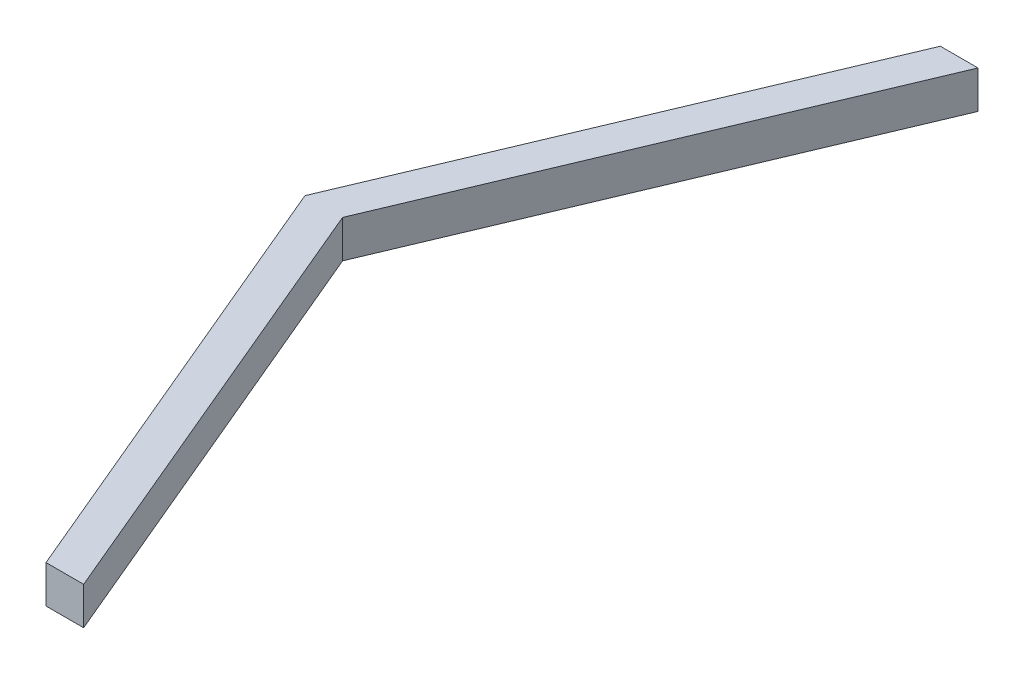
ISO-10303-21;
HEADER;
FILE_DESCRIPTION(('STEP AP214'),'2;1');
FILE_NAME('part.step','',(''),(''),'','','');
FILE_SCHEMA(('AUTOMOTIVE_DESIGN { 1 0 10303 214 1 1 1 1 }'));
ENDSEC;
DATA;
#1=APPLICATION_CONTEXT('core data for automotive mechanical design processes');
#2=APPLICATION_PROTOCOL_DEFINITION('international standard','automotive_design',2000,#1);
#3=PRODUCT_CONTEXT('',#1,'mechanical');
#4=PRODUCT('Part','Part','',(#3));
#5=PRODUCT_RELATED_PRODUCT_CATEGORY('part','',(#4));
#6=PRODUCT_DEFINITION_FORMATION('','',#4);
#7=PRODUCT_DEFINITION_CONTEXT('part definition',#1,'design');
#8=PRODUCT_DEFINITION('design','',#6,#7);
#9=PRODUCT_DEFINITION_SHAPE('','',#8);
#10=(LENGTH_UNIT() NAMED_UNIT(*) SI_UNIT(.MILLI.,.METRE.));
#11=(NAMED_UNIT(*) PLANE_ANGLE_UNIT() SI_UNIT($,.RADIAN.));
#12=(NAMED_UNIT(*) SI_UNIT($,.STERADIAN.) SOLID_ANGLE_UNIT());
#13=UNCERTAINTY_MEASURE_WITH_UNIT(LENGTH_MEASURE(1.E-05),#10,'distance_accuracy_value','');
#14=(GEOMETRIC_REPRESENTATION_CONTEXT(3) GLOBAL_UNCERTAINTY_ASSIGNED_CONTEXT((#13)) GLOBAL_UNIT_ASSIGNED_CONTEXT((#10,
#11,#12)) REPRESENTATION_CONTEXT('',''));
#15=CARTESIAN_POINT('',(0.,0.,0.));
#16=DIRECTION('',(0.,0.,1.));
#17=DIRECTION('',(1.,0.,0.));
#18=AXIS2_PLACEMENT_3D('',#15,#16,#17);
#19=CARTESIAN_POINT('',(-127.,25.4,0.));
#20=DIRECTION('',(-0.921635375138065,0.,-0.388057000058132));
#21=DIRECTION('',(-0.388057000058133,0.,0.921635375138066));
#22=AXIS2_PLACEMENT_3D('',#19,#20,#21);
#23=PLANE('',#22);
#24=DIRECTION('',(0.388057000058133,0.,-0.921635375138065));
#25=VECTOR('',#24,1.);
#26=CARTESIAN_POINT('',(-127.,0.,0.));
#27=LINE('',#26,#25);
#28=CARTESIAN_POINT('',(-127.,0.,0.));
#29=VERTEX_POINT('',#28);
#30=CARTESIAN_POINT('',(-1.08093449726741E-13,0.,-301.625));
#31=VERTEX_POINT('',#30);
#32=EDGE_CURVE('E117',#29,#31,#27,.T.);
#33=ORIENTED_EDGE('',*,*,#32,.T.);
#34=DIRECTION('',(0.,-1.,0.));
#35=VECTOR('',#34,1.);
#36=CARTESIAN_POINT('',(-1.08093449726741E-13,25.4,-301.625));
#37=LINE('',#36,#35);
#38=CARTESIAN_POINT('',(-1.08093449726741E-13,25.4,-301.625));
#39=VERTEX_POINT('',#38);
#40=EDGE_CURVE('E11',#39,#31,#37,.T.);
#41=ORIENTED_EDGE('',*,*,#40,.F.);
#42=DIRECTION('',(0.388057000058133,0.,-0.921635375138065));
#43=VECTOR('',#42,1.);
#44=CARTESIAN_POINT('',(-127.,25.4,0.));
#45=LINE('',#44,#43);
#46=CARTESIAN_POINT('',(-127.,25.4,0.));
#47=VERTEX_POINT('',#46);
#48=EDGE_CURVE('E127',#47,#39,#45,.T.);
#49=ORIENTED_EDGE('',*,*,#48,.F.);
#50=DIRECTION('',(0.,-1.,0.));
#51=VECTOR('',#50,1.);
#52=CARTESIAN_POINT('',(-127.,25.4,0.));
#53=LINE('',#52,#51);
#54=EDGE_CURVE('E113',#47,#29,#53,.T.);
#55=ORIENTED_EDGE('',*,*,#54,.T.);
#56=EDGE_LOOP('',(#33,#41,#49,#55));
#57=FACE_BOUND('',#56,.T.);
#58=ADVANCED_FACE('F33',(#57),#23,.F.);
#59=CARTESIAN_POINT('',(-1.08093449726741E-13,25.4,-301.625));
#60=DIRECTION('',(0.,0.,1.));
#61=DIRECTION('',(1.,0.,0.));
#62=AXIS2_PLACEMENT_3D('',#59,#60,#61);
#63=PLANE('',#62);
#64=DIRECTION('',(-1.,0.,0.));
#65=VECTOR('',#64,1.);
#66=CARTESIAN_POINT('',(-1.08093449726741E-13,0.,-301.625));
#67=LINE('',#66,#65);
#68=CARTESIAN_POINT('',(-25.4000000000001,0.,-301.625));
#69=VERTEX_POINT('',#68);
#70=EDGE_CURVE('E120',#31,#69,#67,.T.);
#71=ORIENTED_EDGE('',*,*,#70,.T.);
#72=DIRECTION('',(0.,-1.,0.));
#73=VECTOR('',#72,1.);
#74=CARTESIAN_POINT('',(-25.4000000000001,25.4,-301.625));
#75=LINE('',#74,#73);
#76=CARTESIAN_POINT('',(-25.4000000000001,25.4,-301.625));
#77=VERTEX_POINT('',#76);
#78=EDGE_CURVE('E41',#77,#69,#75,.T.);
#79=ORIENTED_EDGE('',*,*,#78,.F.);
#80=DIRECTION('',(-1.,0.,0.));
#81=VECTOR('',#80,1.);
#82=CARTESIAN_POINT('',(-1.08093449726741E-13,25.4,-301.625));
#83=LINE('',#82,#81);
#84=EDGE_CURVE('E86',#39,#77,#83,.T.);
#85=ORIENTED_EDGE('',*,*,#84,.F.);
#86=ORIENTED_EDGE('',*,*,#40,.T.);
#87=EDGE_LOOP('',(#71,#79,#85,#86));
#88=FACE_BOUND('',#87,.T.);
#89=ADVANCED_FACE('F151',(#88),#63,.F.);
#90=CARTESIAN_POINT('',(-25.4000000000001,25.4,-301.625));
#91=DIRECTION('',(0.921635375138065,0.,0.388057000058132));
#92=DIRECTION('',(0.388057000058132,0.,-0.921635375138066));
#93=AXIS2_PLACEMENT_3D('',#90,#91,#92);
#94=PLANE('',#93);
#95=DIRECTION('',(-0.388057000058132,0.,0.921635375138065));
#96=VECTOR('',#95,1.);
#97=CARTESIAN_POINT('',(-25.4000000000001,0.,-301.625));
#98=LINE('',#97,#96);
#99=CARTESIAN_POINT('',(-152.4,0.,0.));
#100=VERTEX_POINT('',#99);
#101=EDGE_CURVE('E122',#69,#100,#98,.T.);
#102=ORIENTED_EDGE('',*,*,#101,.T.);
#103=DIRECTION('',(0.,-1.,0.));
#104=VECTOR('',#103,1.);
#105=CARTESIAN_POINT('',(-152.4,25.4,0.));
#106=LINE('',#105,#104);
#107=CARTESIAN_POINT('',(-152.4,25.4,0.));
#108=VERTEX_POINT('',#107);
#109=EDGE_CURVE('E108',#108,#100,#106,.T.);
#110=ORIENTED_EDGE('',*,*,#109,.F.);
#111=DIRECTION('',(-0.388057000058132,0.,0.921635375138065));
#112=VECTOR('',#111,1.);
#113=CARTESIAN_POINT('',(-25.4000000000001,25.4,-301.625));
#114=LINE('',#113,#112);
#115=EDGE_CURVE('E99',#77,#108,#114,.T.);
#116=ORIENTED_EDGE('',*,*,#115,.F.);
#117=ORIENTED_EDGE('',*,*,#78,.T.);
#118=EDGE_LOOP('',(#102,#110,#116,#117));
#119=FACE_BOUND('',#118,.T.);
#120=ADVANCED_FACE('F133',(#119),#94,.F.);
#121=CARTESIAN_POINT('',(-152.4,25.4,0.));
#122=DIRECTION('',(0.921635375138065,0.,-0.388057000058133));
#123=DIRECTION('',(-0.388057000058133,0.,-0.921635375138065));
#124=AXIS2_PLACEMENT_3D('',#121,#122,#123);
#125=PLANE('',#124);
#126=DIRECTION('',(0.388057000058133,0.,0.921635375138065));
#127=VECTOR('',#126,1.);
#128=CARTESIAN_POINT('',(-152.4,0.,0.));
#129=LINE('',#128,#127);
#130=CARTESIAN_POINT('',(-25.3999999999999,0.,301.625));
#131=VERTEX_POINT('',#130);
#132=EDGE_CURVE('E107',#100,#131,#129,.T.);
#133=ORIENTED_EDGE('',*,*,#132,.T.);
#134=DIRECTION('',(0.,-1.,0.));
#135=VECTOR('',#134,1.);
#136=CARTESIAN_POINT('',(-25.3999999999999,25.4,301.625));
#137=LINE('',#136,#135);
#138=CARTESIAN_POINT('',(-25.3999999999999,25.4,301.625));
#139=VERTEX_POINT('',#138);
#140=EDGE_CURVE('E104',#139,#131,#137,.T.);
#141=ORIENTED_EDGE('',*,*,#140,.F.);
#142=DIRECTION('',(0.388057000058133,0.,0.921635375138065));
#143=VECTOR('',#142,1.);
#144=CARTESIAN_POINT('',(-152.4,25.4,0.));
#145=LINE('',#144,#143);
#146=EDGE_CURVE('E93',#108,#139,#145,.T.);
#147=ORIENTED_EDGE('',*,*,#146,.F.);
#148=ORIENTED_EDGE('',*,*,#109,.T.);
#149=EDGE_LOOP('',(#133,#141,#147,#148));
#150=FACE_BOUND('',#149,.T.);
#151=ADVANCED_FACE('F105',(#150),#125,.F.);
#152=CARTESIAN_POINT('',(-25.3999999999999,25.4,301.625));
#153=DIRECTION('',(0.,0.,-1.));
#154=DIRECTION('',(-1.,0.,0.));
#155=AXIS2_PLACEMENT_3D('',#152,#153,#154);
#156=PLANE('',#155);
#157=DIRECTION('',(1.,0.,0.));
#158=VECTOR('',#157,1.);
#159=CARTESIAN_POINT('',(-25.3999999999999,0.,301.625));
#160=LINE('',#159,#158);
#161=CARTESIAN_POINT('',(0.,0.,301.625));
#162=VERTEX_POINT('',#161);
#163=EDGE_CURVE('E72',#131,#162,#160,.T.);
#164=ORIENTED_EDGE('',*,*,#163,.T.);
#165=DIRECTION('',(0.,-1.,0.));
#166=VECTOR('',#165,1.);
#167=CARTESIAN_POINT('',(0.,25.4,301.625));
#168=LINE('',#167,#166);
#169=CARTESIAN_POINT('',(0.,25.4,301.625));
#170=VERTEX_POINT('',#169);
#171=EDGE_CURVE('E109',#170,#162,#168,.T.);
#172=ORIENTED_EDGE('',*,*,#171,.F.);
#173=DIRECTION('',(1.,0.,0.));
#174=VECTOR('',#173,1.);
#175=CARTESIAN_POINT('',(-25.3999999999999,25.4,301.625));
#176=LINE('',#175,#174);
#177=EDGE_CURVE('E97',#139,#170,#176,.T.);
#178=ORIENTED_EDGE('',*,*,#177,.F.);
#179=ORIENTED_EDGE('',*,*,#140,.T.);
#180=EDGE_LOOP('',(#164,#172,#178,#179));
#181=FACE_BOUND('',#180,.T.);
#182=ADVANCED_FACE('F111',(#181),#156,.F.);
#183=CARTESIAN_POINT('',(0.,25.4,301.625));
#184=DIRECTION('',(-0.921635375138065,0.,0.388057000058133));
#185=DIRECTION('',(0.388057000058133,0.,0.921635375138065));
#186=AXIS2_PLACEMENT_3D('',#183,#184,#185);
#187=PLANE('',#186);
#188=DIRECTION('',(-0.388057000058133,0.,-0.921635375138065));
#189=VECTOR('',#188,1.);
#190=CARTESIAN_POINT('',(0.,0.,301.625));
#191=LINE('',#190,#189);
#192=EDGE_CURVE('E78',#162,#29,#191,.T.);
#193=ORIENTED_EDGE('',*,*,#192,.T.);
#194=ORIENTED_EDGE('',*,*,#54,.F.);
#195=DIRECTION('',(-0.388057000058133,0.,-0.921635375138065));
#196=VECTOR('',#195,1.);
#197=CARTESIAN_POINT('',(0.,25.4,301.625));
#198=LINE('',#197,#196);
#199=EDGE_CURVE('E49',#170,#47,#198,.T.);
#200=ORIENTED_EDGE('',*,*,#199,.F.);
#201=ORIENTED_EDGE('',*,*,#171,.T.);
#202=EDGE_LOOP('',(#193,#194,#200,#201));
#203=FACE_BOUND('',#202,.T.);
#204=ADVANCED_FACE('F140',(#203),#187,.F.);
#205=CARTESIAN_POINT('',(0.,25.4,0.));
#206=DIRECTION('',(0.,1.,0.));
#207=DIRECTION('',(0.,0.,1.));
#208=AXIS2_PLACEMENT_3D('',#205,#206,#207);
#209=PLANE('',#208);
#210=ORIENTED_EDGE('',*,*,#48,.T.);
#211=ORIENTED_EDGE('',*,*,#84,.T.);
#212=ORIENTED_EDGE('',*,*,#115,.T.);
#213=ORIENTED_EDGE('',*,*,#146,.T.);
#214=ORIENTED_EDGE('',*,*,#177,.T.);
#215=ORIENTED_EDGE('',*,*,#199,.T.);
#216=EDGE_LOOP('',(#210,#211,#212,#213,#214,#215));
#217=FACE_BOUND('',#216,.T.);
#218=ADVANCED_FACE('F95',(#217),#209,.T.);
#219=CARTESIAN_POINT('',(0.,0.,0.));
#220=DIRECTION('',(0.,1.,0.));
#221=DIRECTION('',(0.,0.,1.));
#222=AXIS2_PLACEMENT_3D('',#219,#220,#221);
#223=PLANE('',#222);
#224=ORIENTED_EDGE('',*,*,#32,.F.);
#225=ORIENTED_EDGE('',*,*,#192,.F.);
#226=ORIENTED_EDGE('',*,*,#163,.F.);
#227=ORIENTED_EDGE('',*,*,#132,.F.);
#228=ORIENTED_EDGE('',*,*,#101,.F.);
#229=ORIENTED_EDGE('',*,*,#70,.F.);
#230=EDGE_LOOP('',(#224,#225,#226,#227,#228,#229));
#231=FACE_BOUND('',#230,.T.);
#232=ADVANCED_FACE('F136',(#231),#223,.F.);
#233=CLOSED_SHELL('',(#58,#89,#120,#151,#182,#204,#218,#232));
#234=MANIFOLD_SOLID_BREP('B2',#233);
#235=ADVANCED_BREP_SHAPE_REPRESENTATION('',(#18,#234),#14);
#236=SHAPE_DEFINITION_REPRESENTATION(#9,#235);
ENDSEC;
END-ISO-10303-21;
